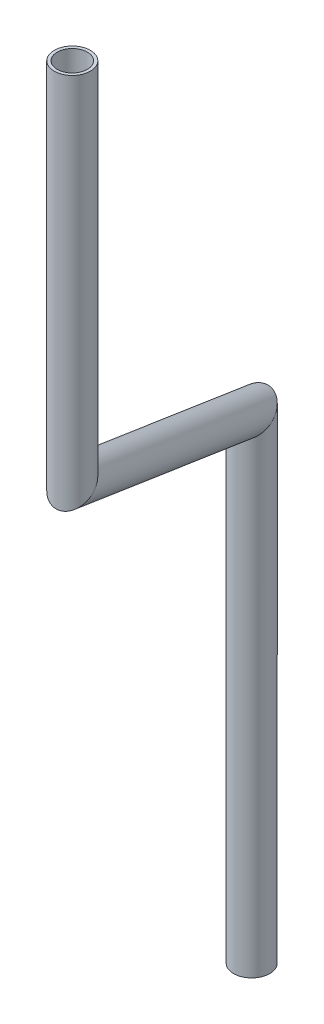
ISO-10303-21;
HEADER;
FILE_DESCRIPTION(('STEP AP214'),'2;1');
FILE_NAME('part.step','',(''),(''),'','','');
FILE_SCHEMA(('AUTOMOTIVE_DESIGN { 1 0 10303 214 1 1 1 1 }'));
ENDSEC;
DATA;
#1=APPLICATION_CONTEXT('core data for automotive mechanical design processes');
#2=APPLICATION_PROTOCOL_DEFINITION('international standard','automotive_design',2000,#1);
#3=PRODUCT_CONTEXT('',#1,'mechanical');
#4=PRODUCT('Part','Part','',(#3));
#5=PRODUCT_RELATED_PRODUCT_CATEGORY('part','',(#4));
#6=PRODUCT_DEFINITION_FORMATION('','',#4);
#7=PRODUCT_DEFINITION_CONTEXT('part definition',#1,'design');
#8=PRODUCT_DEFINITION('design','',#6,#7);
#9=PRODUCT_DEFINITION_SHAPE('','',#8);
#10=(LENGTH_UNIT() NAMED_UNIT(*) SI_UNIT(.MILLI.,.METRE.));
#11=(NAMED_UNIT(*) PLANE_ANGLE_UNIT() SI_UNIT($,.RADIAN.));
#12=(NAMED_UNIT(*) SI_UNIT($,.STERADIAN.) SOLID_ANGLE_UNIT());
#13=UNCERTAINTY_MEASURE_WITH_UNIT(LENGTH_MEASURE(1.E-05),#10,'distance_accuracy_value','');
#14=(GEOMETRIC_REPRESENTATION_CONTEXT(3) GLOBAL_UNCERTAINTY_ASSIGNED_CONTEXT((#13)) GLOBAL_UNIT_ASSIGNED_CONTEXT((#10,
#11,#12)) REPRESENTATION_CONTEXT('',''));
#15=CARTESIAN_POINT('',(0.,0.,0.));
#16=DIRECTION('',(0.,0.,1.));
#17=DIRECTION('',(1.,0.,0.));
#18=AXIS2_PLACEMENT_3D('',#15,#16,#17);
#19=CARTESIAN_POINT('',(-803.872074604472,-198.688949127323,358.350507150414));
#20=DIRECTION('',(0.,1.,0.));
#21=DIRECTION('',(0.,0.,1.));
#22=AXIS2_PLACEMENT_3D('',#19,#20,#21);
#23=CYLINDRICAL_SURFACE('',#22,5.28320000000004);
#24=CARTESIAN_POINT('',(-803.872074604472,-70.1675108197615,358.350507150414));
#25=DIRECTION('',(0.,-1.,0.));
#26=DIRECTION('',(0.,0.,-1.));
#27=AXIS2_PLACEMENT_3D('',#24,#25,#26);
#28=CIRCLE('',#27,5.28320000000004);
#29=CARTESIAN_POINT('',(-803.872074604472,-70.1675108197615,353.067307150414));
#30=VERTEX_POINT('',#29);
#31=EDGE_CURVE('E55',#30,#30,#28,.T.);
#32=ORIENTED_EDGE('',*,*,#31,.F.);
#33=EDGE_LOOP('',(#32));
#34=FACE_BOUND('',#33,.T.);
#35=CARTESIAN_POINT('',(-803.872074604472,-198.688949127323,358.350507150414));
#36=DIRECTION('',(-0.14030513644146,-0.816634248512276,-0.559841917727615));
#37=DIRECTION('',(-0.198521843747276,0.577155528568159,-0.792136713830631));
#38=AXIS2_PLACEMENT_3D('',#35,#36,#37);
#39=ELLIPSE('',#38,6.46948130038,5.28320000000004);
#40=CARTESIAN_POINT('',(-805.156407960312,-194.955052227841,353.225793492942));
#41=VERTEX_POINT('',#40);
#42=EDGE_CURVE('E51',#41,#41,#39,.T.);
#43=ORIENTED_EDGE('',*,*,#42,.T.);
#44=EDGE_LOOP('',(#43));
#45=FACE_BOUND('',#44,.T.);
#46=ADVANCED_FACE('F47',(#34,#45),#23,.F.);
#47=CARTESIAN_POINT('',(-803.872074604472,-198.688949127323,358.350507150414));
#48=DIRECTION('',(0.,1.,0.));
#49=DIRECTION('',(0.,0.,1.));
#50=AXIS2_PLACEMENT_3D('',#47,#48,#49);
#51=CYLINDRICAL_SURFACE('',#50,6.35000000000005);
#52=CARTESIAN_POINT('',(-803.872074604472,-70.1675108197615,358.350507150414));
#53=DIRECTION('',(0.,-1.,0.));
#54=DIRECTION('',(0.,0.,-1.));
#55=AXIS2_PLACEMENT_3D('',#52,#53,#54);
#56=CIRCLE('',#55,6.35000000000005);
#57=CARTESIAN_POINT('',(-803.872074604472,-70.1675108197615,352.000507150414));
#58=VERTEX_POINT('',#57);
#59=EDGE_CURVE('E59',#58,#58,#56,.T.);
#60=ORIENTED_EDGE('',*,*,#59,.T.);
#61=EDGE_LOOP('',(#60));
#62=FACE_BOUND('',#61,.T.);
#63=CARTESIAN_POINT('',(-803.872074604472,-198.688949127323,358.350507150414));
#64=DIRECTION('',(-0.14030513644146,-0.816634248512276,-0.559841917727615));
#65=DIRECTION('',(-0.198521843747276,0.577155528568159,-0.792136713830631));
#66=AXIS2_PLACEMENT_3D('',#63,#64,#65);
#67=ELLIPSE('',#66,7.77581887064904,6.35000000000005);
#68=CARTESIAN_POINT('',(-805.415744503318,-194.201092276984,352.190995542876));
#69=VERTEX_POINT('',#68);
#70=EDGE_CURVE('E12',#69,#69,#67,.T.);
#71=ORIENTED_EDGE('',*,*,#70,.F.);
#72=EDGE_LOOP('',(#71));
#73=FACE_BOUND('',#72,.T.);
#74=ADVANCED_FACE('F74',(#62,#73),#51,.T.);
#75=CARTESIAN_POINT('',(-803.872074604472,-70.1675108197615,358.350507150414));
#76=DIRECTION('',(0.,-1.,0.));
#77=DIRECTION('',(0.,0.,-1.));
#78=AXIS2_PLACEMENT_3D('',#75,#76,#77);
#79=PLANE('',#78);
#80=ORIENTED_EDGE('',*,*,#31,.T.);
#81=EDGE_LOOP('',(#80));
#82=FACE_BOUND('',#81,.T.);
#83=ORIENTED_EDGE('',*,*,#59,.F.);
#84=EDGE_LOOP('',(#83));
#85=FACE_BOUND('',#84,.T.);
#86=ADVANCED_FACE('F70',(#82,#85),#79,.F.);
#87=CARTESIAN_POINT('',(-803.872074604472,-198.688949127323,358.350507150414));
#88=DIRECTION('',(-0.14030513644146,-0.816634248512276,-0.559841917727615));
#89=DIRECTION('',(0.,0.565435024806664,-0.824792842307623));
#90=AXIS2_PLACEMENT_3D('',#87,#88,#89);
#91=PLANE('',#90);
#92=ORIENTED_EDGE('',*,*,#42,.F.);
#93=EDGE_LOOP('',(#92));
#94=FACE_BOUND('',#93,.T.);
#95=ORIENTED_EDGE('',*,*,#70,.T.);
#96=EDGE_LOOP('',(#95));
#97=FACE_BOUND('',#96,.T.);
#98=ADVANCED_FACE('F49',(#94,#97),#91,.T.);
#99=CLOSED_SHELL('',(#46,#74,#86,#98));
#100=MANIFOLD_SOLID_BREP('B2',#99);
#101=CARTESIAN_POINT('',(-824.964556296569,-229.411744476627,274.187833568857));
#102=DIRECTION('',(0.229155959320569,0.333782991686418,0.914372167538325));
#103=DIRECTION('',(0.,-0.939369041079563,0.342907866140836));
#104=AXIS2_PLACEMENT_3D('',#101,#102,#103);
#105=CYLINDRICAL_SURFACE('',#104,5.28320000000004);
#106=CARTESIAN_POINT('',(-824.964556296569,-229.411744476627,274.187833568857));
#107=DIRECTION('',(-0.14030513644146,-0.816634248512276,-0.559841917727615));
#108=DIRECTION('',(0.198521843747276,-0.577155528568159,0.792136713830631));
#109=AXIS2_PLACEMENT_3D('',#106,#107,#108);
#110=ELLIPSE('',#109,6.46948130038,5.28320000000004);
#111=CARTESIAN_POINT('',(-823.680222940729,-233.14564137611,279.312547226329));
#112=VERTEX_POINT('',#111);
#113=EDGE_CURVE('E150',#112,#112,#110,.T.);
#114=ORIENTED_EDGE('',*,*,#113,.T.);
#115=EDGE_LOOP('',(#114));
#116=FACE_BOUND('',#115,.T.);
#117=CARTESIAN_POINT('',(-803.872074604472,-198.688949127323,358.350507150414));
#118=DIRECTION('',(0.14030513644146,0.816634248512276,0.559841917727615));
#119=DIRECTION('',(0.198521843747276,-0.577155528568159,0.792136713830631));
#120=AXIS2_PLACEMENT_3D('',#117,#118,#119);
#121=ELLIPSE('',#120,6.46948130038,5.28320000000004);
#122=CARTESIAN_POINT('',(-802.587741248632,-202.422846026806,363.475220807886));
#123=VERTEX_POINT('',#122);
#124=EDGE_CURVE('E140',#123,#123,#121,.T.);
#125=ORIENTED_EDGE('',*,*,#124,.T.);
#126=EDGE_LOOP('',(#125));
#127=FACE_BOUND('',#126,.T.);
#128=ADVANCED_FACE('F136',(#116,#127),#105,.F.);
#129=CARTESIAN_POINT('',(-824.964556296569,-229.411744476627,274.187833568857));
#130=DIRECTION('',(0.229155959320569,0.333782991686418,0.914372167538325));
#131=DIRECTION('',(0.,-0.939369041079563,0.342907866140836));
#132=AXIS2_PLACEMENT_3D('',#129,#130,#131);
#133=CYLINDRICAL_SURFACE('',#132,6.35000000000005);
#134=CARTESIAN_POINT('',(-824.964556296569,-229.411744476627,274.187833568857));
#135=DIRECTION('',(-0.14030513644146,-0.816634248512276,-0.559841917727615));
#136=DIRECTION('',(0.198521843747276,-0.577155528568159,0.792136713830631));
#137=AXIS2_PLACEMENT_3D('',#134,#135,#136);
#138=ELLIPSE('',#137,7.77581887064904,6.35000000000005);
#139=CARTESIAN_POINT('',(-823.420886397723,-233.899601326967,280.347345176395));
#140=VERTEX_POINT('',#139);
#141=EDGE_CURVE('E144',#140,#140,#138,.T.);
#142=ORIENTED_EDGE('',*,*,#141,.F.);
#143=EDGE_LOOP('',(#142));
#144=FACE_BOUND('',#143,.T.);
#145=CARTESIAN_POINT('',(-803.872074604472,-198.688949127323,358.350507150414));
#146=DIRECTION('',(0.14030513644146,0.816634248512276,0.559841917727615));
#147=DIRECTION('',(0.198521843747276,-0.577155528568159,0.792136713830631));
#148=AXIS2_PLACEMENT_3D('',#145,#146,#147);
#149=ELLIPSE('',#148,7.77581887064904,6.35000000000005);
#150=CARTESIAN_POINT('',(-802.328404705625,-203.176805977663,364.510018757952));
#151=VERTEX_POINT('',#150);
#152=EDGE_CURVE('E46',#151,#151,#149,.T.);
#153=ORIENTED_EDGE('',*,*,#152,.F.);
#154=EDGE_LOOP('',(#153));
#155=FACE_BOUND('',#154,.T.);
#156=ADVANCED_FACE('F163',(#144,#155),#133,.T.);
#157=CARTESIAN_POINT('',(-824.964556296569,-229.411744476627,274.187833568857));
#158=DIRECTION('',(-0.14030513644146,-0.816634248512276,-0.559841917727615));
#159=DIRECTION('',(0.,0.565435024806664,-0.824792842307623));
#160=AXIS2_PLACEMENT_3D('',#157,#158,#159);
#161=PLANE('',#160);
#162=ORIENTED_EDGE('',*,*,#113,.F.);
#163=EDGE_LOOP('',(#162));
#164=FACE_BOUND('',#163,.T.);
#165=ORIENTED_EDGE('',*,*,#141,.T.);
#166=EDGE_LOOP('',(#165));
#167=FACE_BOUND('',#166,.T.);
#168=ADVANCED_FACE('F159',(#164,#167),#161,.T.);
#169=CARTESIAN_POINT('',(-803.872074604472,-198.688949127323,358.350507150414));
#170=DIRECTION('',(0.14030513644146,0.816634248512276,0.559841917727615));
#171=DIRECTION('',(0.,-0.565435024806664,0.824792842307623));
#172=AXIS2_PLACEMENT_3D('',#169,#170,#171);
#173=PLANE('',#172);
#174=ORIENTED_EDGE('',*,*,#124,.F.);
#175=EDGE_LOOP('',(#174));
#176=FACE_BOUND('',#175,.T.);
#177=ORIENTED_EDGE('',*,*,#152,.T.);
#178=EDGE_LOOP('',(#177));
#179=FACE_BOUND('',#178,.T.);
#180=ADVANCED_FACE('F138',(#176,#179),#173,.T.);
#181=CLOSED_SHELL('',(#128,#156,#168,#180));
#182=MANIFOLD_SOLID_BREP('B7',#181);
#183=CARTESIAN_POINT('',(-824.964556296567,-397.526501206854,274.187833568861));
#184=DIRECTION('',(0.,1.,0.));
#185=DIRECTION('',(0.,0.,1.));
#186=AXIS2_PLACEMENT_3D('',#183,#184,#185);
#187=CYLINDRICAL_SURFACE('',#186,5.28320000000004);
#188=CARTESIAN_POINT('',(-824.964556296567,-397.526501206854,274.187833568861));
#189=DIRECTION('',(0.,-1.,0.));
#190=DIRECTION('',(0.,0.,-1.));
#191=AXIS2_PLACEMENT_3D('',#188,#189,#190);
#192=CIRCLE('',#191,5.28320000000004);
#193=CARTESIAN_POINT('',(-824.964556296567,-397.526501206854,268.904633568861));
#194=VERTEX_POINT('',#193);
#195=EDGE_CURVE('E234',#194,#194,#192,.T.);
#196=ORIENTED_EDGE('',*,*,#195,.T.);
#197=EDGE_LOOP('',(#196));
#198=FACE_BOUND('',#197,.T.);
#199=CARTESIAN_POINT('',(-824.964556296568,-229.411744476629,274.18783356886));
#200=DIRECTION('',(0.14030513644146,0.816634248512276,0.559841917727615));
#201=DIRECTION('',(-0.198521843747285,0.577155528568159,-0.792136713830629));
#202=AXIS2_PLACEMENT_3D('',#199,#200,#201);
#203=ELLIPSE('',#202,6.46948130038005,5.28320000000004);
#204=CARTESIAN_POINT('',(-826.248889652408,-225.677847577147,269.063119911388));
#205=VERTEX_POINT('',#204);
#206=EDGE_CURVE('E224',#205,#205,#203,.T.);
#207=ORIENTED_EDGE('',*,*,#206,.T.);
#208=EDGE_LOOP('',(#207));
#209=FACE_BOUND('',#208,.T.);
#210=ADVANCED_FACE('F220',(#198,#209),#187,.F.);
#211=CARTESIAN_POINT('',(-824.964556296567,-397.526501206854,274.187833568861));
#212=DIRECTION('',(0.,1.,0.));
#213=DIRECTION('',(0.,0.,1.));
#214=AXIS2_PLACEMENT_3D('',#211,#212,#213);
#215=CYLINDRICAL_SURFACE('',#214,6.35000000000005);
#216=CARTESIAN_POINT('',(-824.964556296567,-397.526501206854,274.187833568861));
#217=DIRECTION('',(0.,-1.,0.));
#218=DIRECTION('',(0.,0.,-1.));
#219=AXIS2_PLACEMENT_3D('',#216,#217,#218);
#220=CIRCLE('',#219,6.35000000000005);
#221=CARTESIAN_POINT('',(-824.964556296567,-397.526501206854,267.837833568861));
#222=VERTEX_POINT('',#221);
#223=EDGE_CURVE('E228',#222,#222,#220,.T.);
#224=ORIENTED_EDGE('',*,*,#223,.F.);
#225=EDGE_LOOP('',(#224));
#226=FACE_BOUND('',#225,.T.);
#227=CARTESIAN_POINT('',(-824.964556296568,-229.411744476629,274.18783356886));
#228=DIRECTION('',(0.14030513644146,0.816634248512276,0.559841917727615));
#229=DIRECTION('',(-0.198521843747285,0.577155528568159,-0.792136713830629));
#230=AXIS2_PLACEMENT_3D('',#227,#228,#229);
#231=ELLIPSE('',#230,7.77581887064909,6.35000000000005);
#232=CARTESIAN_POINT('',(-826.508226195414,-224.92388762629,268.028321961322));
#233=VERTEX_POINT('',#232);
#234=EDGE_CURVE('E135',#233,#233,#231,.T.);
#235=ORIENTED_EDGE('',*,*,#234,.F.);
#236=EDGE_LOOP('',(#235));
#237=FACE_BOUND('',#236,.T.);
#238=ADVANCED_FACE('F247',(#226,#237),#215,.T.);
#239=CARTESIAN_POINT('',(-824.964556296567,-397.526501206854,274.187833568861));
#240=DIRECTION('',(0.,-1.,0.));
#241=DIRECTION('',(0.,0.,-1.));
#242=AXIS2_PLACEMENT_3D('',#239,#240,#241);
#243=PLANE('',#242);
#244=ORIENTED_EDGE('',*,*,#195,.F.);
#245=EDGE_LOOP('',(#244));
#246=FACE_BOUND('',#245,.T.);
#247=ORIENTED_EDGE('',*,*,#223,.T.);
#248=EDGE_LOOP('',(#247));
#249=FACE_BOUND('',#248,.T.);
#250=ADVANCED_FACE('F243',(#246,#249),#243,.T.);
#251=CARTESIAN_POINT('',(-824.964556296569,-229.411744476627,274.187833568857));
#252=DIRECTION('',(0.14030513644146,0.816634248512276,0.559841917727615));
#253=DIRECTION('',(0.,-0.565435024806664,0.824792842307623));
#254=AXIS2_PLACEMENT_3D('',#251,#252,#253);
#255=PLANE('',#254);
#256=ORIENTED_EDGE('',*,*,#206,.F.);
#257=EDGE_LOOP('',(#256));
#258=FACE_BOUND('',#257,.T.);
#259=ORIENTED_EDGE('',*,*,#234,.T.);
#260=EDGE_LOOP('',(#259));
#261=FACE_BOUND('',#260,.T.);
#262=ADVANCED_FACE('F222',(#258,#261),#255,.T.);
#263=CLOSED_SHELL('',(#210,#238,#250,#262));
#264=MANIFOLD_SOLID_BREP('B41',#263);
#265=ADVANCED_BREP_SHAPE_REPRESENTATION('',(#18,#100,#182,#264),#14);
#266=SHAPE_DEFINITION_REPRESENTATION(#9,#265);
ENDSEC;
END-ISO-10303-21;
